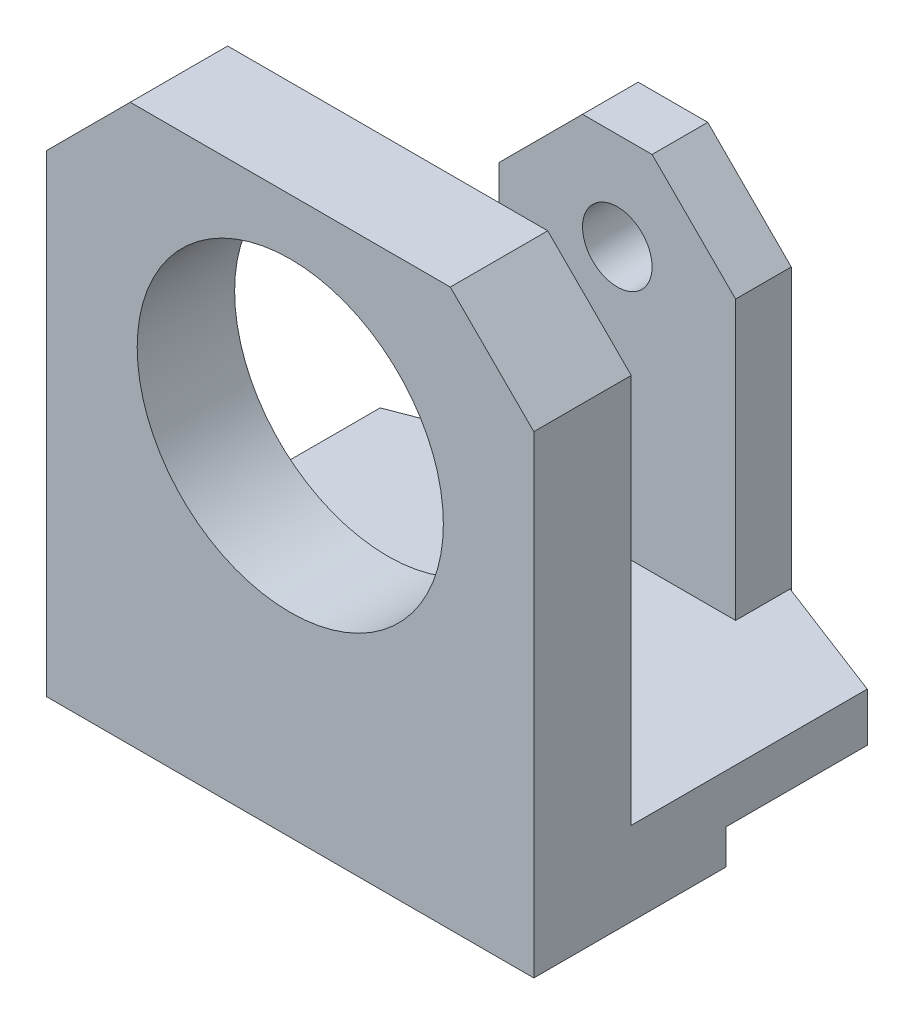
ISO-10303-21;
HEADER;
FILE_DESCRIPTION(('STEP AP214'),'2;1');
FILE_NAME('part.step','',(''),(''),'','','');
FILE_SCHEMA(('AUTOMOTIVE_DESIGN { 1 0 10303 214 1 1 1 1 }'));
ENDSEC;
DATA;
#1=APPLICATION_CONTEXT('core data for automotive mechanical design processes');
#2=APPLICATION_PROTOCOL_DEFINITION('international standard','automotive_design',2000,#1);
#3=PRODUCT_CONTEXT('',#1,'mechanical');
#4=PRODUCT('Part','Part','',(#3));
#5=PRODUCT_RELATED_PRODUCT_CATEGORY('part','',(#4));
#6=PRODUCT_DEFINITION_FORMATION('','',#4);
#7=PRODUCT_DEFINITION_CONTEXT('part definition',#1,'design');
#8=PRODUCT_DEFINITION('design','',#6,#7);
#9=PRODUCT_DEFINITION_SHAPE('','',#8);
#10=(LENGTH_UNIT() NAMED_UNIT(*) SI_UNIT(.MILLI.,.METRE.));
#11=(NAMED_UNIT(*) PLANE_ANGLE_UNIT() SI_UNIT($,.RADIAN.));
#12=(NAMED_UNIT(*) SI_UNIT($,.STERADIAN.) SOLID_ANGLE_UNIT());
#13=UNCERTAINTY_MEASURE_WITH_UNIT(LENGTH_MEASURE(1.E-05),#10,'distance_accuracy_value','');
#14=(GEOMETRIC_REPRESENTATION_CONTEXT(3) GLOBAL_UNCERTAINTY_ASSIGNED_CONTEXT((#13)) GLOBAL_UNIT_ASSIGNED_CONTEXT((#10,
#11,#12)) REPRESENTATION_CONTEXT('',''));
#15=CARTESIAN_POINT('',(0.,0.,0.));
#16=DIRECTION('',(0.,0.,1.));
#17=DIRECTION('',(1.,0.,0.));
#18=AXIS2_PLACEMENT_3D('',#15,#16,#17);
#19=CARTESIAN_POINT('',(0.,0.,0.));
#20=DIRECTION('',(0.,0.,1.));
#21=DIRECTION('',(1.,0.,0.));
#22=AXIS2_PLACEMENT_3D('',#19,#20,#21);
#23=PLANE('',#22);
#24=CARTESIAN_POINT('',(0.,0.,0.));
#25=DIRECTION('',(0.,0.,1.));
#26=DIRECTION('',(1.,0.,0.));
#27=AXIS2_PLACEMENT_3D('',#24,#25,#26);
#28=CIRCLE('',#27,11.);
#29=CARTESIAN_POINT('',(11.,0.,0.));
#30=VERTEX_POINT('',#29);
#31=EDGE_CURVE('E279',#30,#30,#28,.T.);
#32=ORIENTED_EDGE('',*,*,#31,.T.);
#33=EDGE_LOOP('',(#32));
#34=FACE_BOUND('',#33,.T.);
#35=DIRECTION('',(0.,-1.,0.));
#36=VECTOR('',#35,1.);
#37=CARTESIAN_POINT('',(-17.5,15.,0.));
#38=LINE('',#37,#36);
#39=CARTESIAN_POINT('',(-17.5,8.99999999999999,0.));
#40=VERTEX_POINT('',#39);
#41=CARTESIAN_POINT('',(-17.5,-19.,0.));
#42=VERTEX_POINT('',#41);
#43=EDGE_CURVE('E275',#40,#42,#38,.T.);
#44=ORIENTED_EDGE('',*,*,#43,.F.);
#45=DIRECTION('',(-0.707106781186548,-0.707106781186548,0.));
#46=VECTOR('',#45,1.);
#47=CARTESIAN_POINT('',(-17.5,8.99999999999999,0.));
#48=LINE('',#47,#46);
#49=CARTESIAN_POINT('',(-11.5,15.,0.));
#50=VERTEX_POINT('',#49);
#51=EDGE_CURVE('E227',#40,#50,#48,.F.);
#52=ORIENTED_EDGE('',*,*,#51,.T.);
#53=DIRECTION('',(-1.,0.,0.));
#54=VECTOR('',#53,1.);
#55=CARTESIAN_POINT('',(17.5,15.,0.));
#56=LINE('',#55,#54);
#57=CARTESIAN_POINT('',(11.5,15.,0.));
#58=VERTEX_POINT('',#57);
#59=EDGE_CURVE('E270',#58,#50,#56,.T.);
#60=ORIENTED_EDGE('',*,*,#59,.F.);
#61=DIRECTION('',(-0.707106781186548,0.707106781186548,0.));
#62=VECTOR('',#61,1.);
#63=CARTESIAN_POINT('',(11.5,15.,0.));
#64=LINE('',#63,#62);
#65=CARTESIAN_POINT('',(17.5,8.99999999999999,0.));
#66=VERTEX_POINT('',#65);
#67=EDGE_CURVE('E225',#58,#66,#64,.F.);
#68=ORIENTED_EDGE('',*,*,#67,.T.);
#69=DIRECTION('',(0.,1.,0.));
#70=VECTOR('',#69,1.);
#71=CARTESIAN_POINT('',(17.5,-25.,0.));
#72=LINE('',#71,#70);
#73=CARTESIAN_POINT('',(17.5,-19.,0.));
#74=VERTEX_POINT('',#73);
#75=EDGE_CURVE('E200',#74,#66,#72,.T.);
#76=ORIENTED_EDGE('',*,*,#75,.F.);
#77=DIRECTION('',(1.,0.,0.));
#78=VECTOR('',#77,1.);
#79=CARTESIAN_POINT('',(17.5,-19.,0.));
#80=LINE('',#79,#78);
#81=EDGE_CURVE('E294',#42,#74,#80,.T.);
#82=ORIENTED_EDGE('',*,*,#81,.F.);
#83=EDGE_LOOP('',(#44,#52,#60,#68,#76,#82));
#84=FACE_BOUND('',#83,.T.);
#85=ADVANCED_FACE('F41',(#34,#84),#23,.F.);
#86=CARTESIAN_POINT('',(0.,0.,7.));
#87=DIRECTION('',(0.,0.,1.));
#88=DIRECTION('',(1.,0.,0.));
#89=AXIS2_PLACEMENT_3D('',#86,#87,#88);
#90=PLANE('',#89);
#91=DIRECTION('',(-1.,0.,0.));
#92=VECTOR('',#91,1.);
#93=CARTESIAN_POINT('',(17.5,15.,7.));
#94=LINE('',#93,#92);
#95=CARTESIAN_POINT('',(11.5,15.,7.));
#96=VERTEX_POINT('',#95);
#97=CARTESIAN_POINT('',(-11.5,15.,7.));
#98=VERTEX_POINT('',#97);
#99=EDGE_CURVE('E272',#96,#98,#94,.T.);
#100=ORIENTED_EDGE('',*,*,#99,.T.);
#101=DIRECTION('',(0.707106781186548,0.707106781186548,0.));
#102=VECTOR('',#101,1.);
#103=CARTESIAN_POINT('',(-13.25,13.25,7.));
#104=LINE('',#103,#102);
#105=CARTESIAN_POINT('',(-17.5,8.99999999999999,7.));
#106=VERTEX_POINT('',#105);
#107=EDGE_CURVE('E236',#98,#106,#104,.F.);
#108=ORIENTED_EDGE('',*,*,#107,.T.);
#109=DIRECTION('',(0.,-1.,0.));
#110=VECTOR('',#109,1.);
#111=CARTESIAN_POINT('',(-17.5,15.,7.));
#112=LINE('',#111,#110);
#113=CARTESIAN_POINT('',(-17.5,-25.,7.));
#114=VERTEX_POINT('',#113);
#115=EDGE_CURVE('E283',#106,#114,#112,.T.);
#116=ORIENTED_EDGE('',*,*,#115,.T.);
#117=DIRECTION('',(1.,0.,0.));
#118=VECTOR('',#117,1.);
#119=CARTESIAN_POINT('',(-17.5,-25.,7.));
#120=LINE('',#119,#118);
#121=CARTESIAN_POINT('',(17.5,-25.,7.));
#122=VERTEX_POINT('',#121);
#123=EDGE_CURVE('E197',#114,#122,#120,.T.);
#124=ORIENTED_EDGE('',*,*,#123,.T.);
#125=DIRECTION('',(0.,1.,0.));
#126=VECTOR('',#125,1.);
#127=CARTESIAN_POINT('',(17.5,-25.,7.));
#128=LINE('',#127,#126);
#129=CARTESIAN_POINT('',(17.5,8.99999999999999,7.));
#130=VERTEX_POINT('',#129);
#131=EDGE_CURVE('E193',#122,#130,#128,.T.);
#132=ORIENTED_EDGE('',*,*,#131,.T.);
#133=DIRECTION('',(0.707106781186548,-0.707106781186548,0.));
#134=VECTOR('',#133,1.);
#135=CARTESIAN_POINT('',(13.25,13.25,7.));
#136=LINE('',#135,#134);
#137=EDGE_CURVE('E234',#130,#96,#136,.F.);
#138=ORIENTED_EDGE('',*,*,#137,.T.);
#139=EDGE_LOOP('',(#100,#108,#116,#124,#132,#138));
#140=FACE_BOUND('',#139,.T.);
#141=CARTESIAN_POINT('',(0.,0.,7.));
#142=DIRECTION('',(0.,0.,1.));
#143=DIRECTION('',(1.,0.,0.));
#144=AXIS2_PLACEMENT_3D('',#141,#142,#143);
#145=CIRCLE('',#144,11.);
#146=CARTESIAN_POINT('',(11.,0.,7.));
#147=VERTEX_POINT('',#146);
#148=EDGE_CURVE('E276',#147,#147,#145,.T.);
#149=ORIENTED_EDGE('',*,*,#148,.F.);
#150=EDGE_LOOP('',(#149));
#151=FACE_BOUND('',#150,.T.);
#152=ADVANCED_FACE('F262',(#140,#151),#90,.T.);
#153=CARTESIAN_POINT('',(17.5,15.,7.));
#154=DIRECTION('',(0.,-1.,0.));
#155=DIRECTION('',(0.,0.,-1.));
#156=AXIS2_PLACEMENT_3D('',#153,#154,#155);
#157=PLANE('',#156);
#158=ORIENTED_EDGE('',*,*,#59,.T.);
#159=DIRECTION('',(0.,0.,1.));
#160=VECTOR('',#159,1.);
#161=CARTESIAN_POINT('',(-11.5,15.,7.));
#162=LINE('',#161,#160);
#163=EDGE_CURVE('E232',#50,#98,#162,.T.);
#164=ORIENTED_EDGE('',*,*,#163,.T.);
#165=ORIENTED_EDGE('',*,*,#99,.F.);
#166=DIRECTION('',(0.,0.,-1.));
#167=VECTOR('',#166,1.);
#168=CARTESIAN_POINT('',(11.5,15.,7.));
#169=LINE('',#168,#167);
#170=EDGE_CURVE('E229',#96,#58,#169,.T.);
#171=ORIENTED_EDGE('',*,*,#170,.T.);
#172=EDGE_LOOP('',(#158,#164,#165,#171));
#173=FACE_BOUND('',#172,.T.);
#174=ADVANCED_FACE('F269',(#173),#157,.F.);
#175=CARTESIAN_POINT('',(-17.5,15.,7.));
#176=DIRECTION('',(1.,0.,0.));
#177=DIRECTION('',(0.,0.,-1.));
#178=AXIS2_PLACEMENT_3D('',#175,#176,#177);
#179=PLANE('',#178);
#180=DIRECTION('',(0.,1.,0.));
#181=VECTOR('',#180,1.);
#182=CARTESIAN_POINT('',(-17.5,15.,-16.9606368420425));
#183=LINE('',#182,#181);
#184=CARTESIAN_POINT('',(-17.5,-19.,-16.9606368420425));
#185=VERTEX_POINT('',#184);
#186=CARTESIAN_POINT('',(-17.5,-22.5,-16.9606368420425));
#187=VERTEX_POINT('',#186);
#188=EDGE_CURVE('E215',#185,#187,#183,.F.);
#189=ORIENTED_EDGE('',*,*,#188,.T.);
#190=DIRECTION('',(0.,0.,-1.));
#191=VECTOR('',#190,1.);
#192=CARTESIAN_POINT('',(-17.5,-22.5,-6.80000000000002));
#193=LINE('',#192,#191);
#194=CARTESIAN_POINT('',(-17.5,-22.5,-6.80000000000002));
#195=VERTEX_POINT('',#194);
#196=EDGE_CURVE('E327',#195,#187,#193,.T.);
#197=ORIENTED_EDGE('',*,*,#196,.F.);
#198=DIRECTION('',(0.,1.,0.));
#199=VECTOR('',#198,1.);
#200=CARTESIAN_POINT('',(-17.5,-25.,-6.80000000000002));
#201=LINE('',#200,#199);
#202=CARTESIAN_POINT('',(-17.5,-25.,-6.80000000000002));
#203=VERTEX_POINT('',#202);
#204=EDGE_CURVE('E189',#203,#195,#201,.T.);
#205=ORIENTED_EDGE('',*,*,#204,.F.);
#206=DIRECTION('',(0.,0.,-1.));
#207=VECTOR('',#206,1.);
#208=CARTESIAN_POINT('',(-17.5,-25.,7.));
#209=LINE('',#208,#207);
#210=EDGE_CURVE('E188',#114,#203,#209,.T.);
#211=ORIENTED_EDGE('',*,*,#210,.F.);
#212=ORIENTED_EDGE('',*,*,#115,.F.);
#213=DIRECTION('',(0.,0.,-1.));
#214=VECTOR('',#213,1.);
#215=CARTESIAN_POINT('',(-17.5,8.99999999999999,7.));
#216=LINE('',#215,#214);
#217=EDGE_CURVE('E222',#106,#40,#216,.T.);
#218=ORIENTED_EDGE('',*,*,#217,.T.);
#219=ORIENTED_EDGE('',*,*,#43,.T.);
#220=DIRECTION('',(0.,0.,1.));
#221=VECTOR('',#220,1.);
#222=CARTESIAN_POINT('',(-17.5,-19.,-16.5));
#223=LINE('',#222,#221);
#224=EDGE_CURVE('E287',#185,#42,#223,.T.);
#225=ORIENTED_EDGE('',*,*,#224,.F.);
#226=EDGE_LOOP('',(#189,#197,#205,#211,#212,#218,#219,#225));
#227=FACE_BOUND('',#226,.T.);
#228=ADVANCED_FACE('F335',(#227),#179,.F.);
#229=CARTESIAN_POINT('',(-17.5,-25.,7.));
#230=DIRECTION('',(0.,1.,0.));
#231=DIRECTION('',(-1.,0.,0.));
#232=AXIS2_PLACEMENT_3D('',#229,#230,#231);
#233=PLANE('',#232);
#234=ORIENTED_EDGE('',*,*,#210,.T.);
#235=DIRECTION('',(-1.,0.,0.));
#236=VECTOR('',#235,1.);
#237=CARTESIAN_POINT('',(17.5,-25.,-6.80000000000002));
#238=LINE('',#237,#236);
#239=CARTESIAN_POINT('',(17.5,-25.,-6.80000000000002));
#240=VERTEX_POINT('',#239);
#241=EDGE_CURVE('E171',#240,#203,#238,.T.);
#242=ORIENTED_EDGE('',*,*,#241,.F.);
#243=DIRECTION('',(0.,0.,-1.));
#244=VECTOR('',#243,1.);
#245=CARTESIAN_POINT('',(17.5,-25.,7.));
#246=LINE('',#245,#244);
#247=EDGE_CURVE('E185',#122,#240,#246,.T.);
#248=ORIENTED_EDGE('',*,*,#247,.F.);
#249=ORIENTED_EDGE('',*,*,#123,.F.);
#250=EDGE_LOOP('',(#234,#242,#248,#249));
#251=FACE_BOUND('',#250,.T.);
#252=ADVANCED_FACE('F183',(#251),#233,.F.);
#253=CARTESIAN_POINT('',(17.5,-25.,7.));
#254=DIRECTION('',(-1.,0.,0.));
#255=DIRECTION('',(0.,0.,1.));
#256=AXIS2_PLACEMENT_3D('',#253,#254,#255);
#257=PLANE('',#256);
#258=DIRECTION('',(0.,-1.,0.));
#259=VECTOR('',#258,1.);
#260=CARTESIAN_POINT('',(17.5,-25.,-6.80000000000002));
#261=LINE('',#260,#259);
#262=CARTESIAN_POINT('',(17.5,-22.5,-6.80000000000002));
#263=VERTEX_POINT('',#262);
#264=EDGE_CURVE('E168',#263,#240,#261,.T.);
#265=ORIENTED_EDGE('',*,*,#264,.F.);
#266=DIRECTION('',(0.,0.,-1.));
#267=VECTOR('',#266,1.);
#268=CARTESIAN_POINT('',(17.5,-22.5,-6.80000000000002));
#269=LINE('',#268,#267);
#270=CARTESIAN_POINT('',(17.5,-22.5,-16.9606368420425));
#271=VERTEX_POINT('',#270);
#272=EDGE_CURVE('E326',#263,#271,#269,.T.);
#273=ORIENTED_EDGE('',*,*,#272,.T.);
#274=DIRECTION('',(0.,-1.,0.));
#275=VECTOR('',#274,1.);
#276=CARTESIAN_POINT('',(17.5,-25.,-16.9606368420425));
#277=LINE('',#276,#275);
#278=CARTESIAN_POINT('',(17.5,-19.,-16.9606368420425));
#279=VERTEX_POINT('',#278);
#280=EDGE_CURVE('E218',#271,#279,#277,.F.);
#281=ORIENTED_EDGE('',*,*,#280,.T.);
#282=DIRECTION('',(0.,0.,1.));
#283=VECTOR('',#282,1.);
#284=CARTESIAN_POINT('',(17.5,-19.,-16.5));
#285=LINE('',#284,#283);
#286=EDGE_CURVE('E291',#279,#74,#285,.T.);
#287=ORIENTED_EDGE('',*,*,#286,.T.);
#288=ORIENTED_EDGE('',*,*,#75,.T.);
#289=DIRECTION('',(0.,0.,1.));
#290=VECTOR('',#289,1.);
#291=CARTESIAN_POINT('',(17.5,8.99999999999999,7.));
#292=LINE('',#291,#290);
#293=EDGE_CURVE('E50',#66,#130,#292,.T.);
#294=ORIENTED_EDGE('',*,*,#293,.T.);
#295=ORIENTED_EDGE('',*,*,#131,.F.);
#296=ORIENTED_EDGE('',*,*,#247,.T.);
#297=EDGE_LOOP('',(#265,#273,#281,#287,#288,#294,#295,#296));
#298=FACE_BOUND('',#297,.T.);
#299=ADVANCED_FACE('F191',(#298),#257,.F.);
#300=CARTESIAN_POINT('',(0.,0.,7.));
#301=DIRECTION('',(0.,0.,-1.));
#302=DIRECTION('',(-1.,0.,0.));
#303=AXIS2_PLACEMENT_3D('',#300,#301,#302);
#304=CYLINDRICAL_SURFACE('',#303,11.);
#305=ORIENTED_EDGE('',*,*,#148,.T.);
#306=EDGE_LOOP('',(#305));
#307=FACE_BOUND('',#306,.T.);
#308=ORIENTED_EDGE('',*,*,#31,.F.);
#309=EDGE_LOOP('',(#308));
#310=FACE_BOUND('',#309,.T.);
#311=ADVANCED_FACE('F394',(#307,#310),#304,.F.);
#312=CARTESIAN_POINT('',(17.5,-19.,-16.5));
#313=DIRECTION('',(0.,-1.,0.));
#314=DIRECTION('',(0.,0.,-1.));
#315=AXIS2_PLACEMENT_3D('',#312,#313,#314);
#316=PLANE('',#315);
#317=ORIENTED_EDGE('',*,*,#81,.T.);
#318=ORIENTED_EDGE('',*,*,#286,.F.);
#319=DIRECTION('',(0.933580426497199,0.,0.358367949545307));
#320=VECTOR('',#319,1.);
#321=CARTESIAN_POINT('',(17.6541131047136,-19.,-16.9014783638153));
#322=LINE('',#321,#320);
#323=CARTESIAN_POINT('',(8.5,-19.,-20.4154131573613));
#324=VERTEX_POINT('',#323);
#325=EDGE_CURVE('E220',#279,#324,#322,.F.);
#326=ORIENTED_EDGE('',*,*,#325,.T.);
#327=DIRECTION('',(0.,0.,-1.));
#328=VECTOR('',#327,1.);
#329=CARTESIAN_POINT('',(8.5,-19.,-16.5));
#330=LINE('',#329,#328);
#331=CARTESIAN_POINT('',(8.5,-19.,-16.5));
#332=VERTEX_POINT('',#331);
#333=EDGE_CURVE('E206',#332,#324,#330,.T.);
#334=ORIENTED_EDGE('',*,*,#333,.F.);
#335=DIRECTION('',(1.,0.,0.));
#336=VECTOR('',#335,1.);
#337=CARTESIAN_POINT('',(17.5,-19.,-16.5));
#338=LINE('',#337,#336);
#339=CARTESIAN_POINT('',(-8.5,-19.,-16.5));
#340=VERTEX_POINT('',#339);
#341=EDGE_CURVE('E293',#340,#332,#338,.T.);
#342=ORIENTED_EDGE('',*,*,#341,.F.);
#343=DIRECTION('',(0.,0.,1.));
#344=VECTOR('',#343,1.);
#345=CARTESIAN_POINT('',(-8.5,-19.,-16.5));
#346=LINE('',#345,#344);
#347=CARTESIAN_POINT('',(-8.5,-19.,-20.4154131573613));
#348=VERTEX_POINT('',#347);
#349=EDGE_CURVE('E195',#348,#340,#346,.T.);
#350=ORIENTED_EDGE('',*,*,#349,.F.);
#351=DIRECTION('',(0.933580426497199,0.,-0.358367949545307));
#352=VECTOR('',#351,1.);
#353=CARTESIAN_POINT('',(12.8509213411407,-19.,-28.6112639750955));
#354=LINE('',#353,#352);
#355=EDGE_CURVE('E212',#348,#185,#354,.F.);
#356=ORIENTED_EDGE('',*,*,#355,.T.);
#357=ORIENTED_EDGE('',*,*,#224,.T.);
#358=EDGE_LOOP('',(#317,#318,#326,#334,#342,#350,#356,#357));
#359=FACE_BOUND('',#358,.T.);
#360=ADVANCED_FACE('F362',(#359),#316,.F.);
#361=CARTESIAN_POINT('',(0.,0.,-20.5));
#362=DIRECTION('',(0.,0.,1.));
#363=DIRECTION('',(1.,0.,0.));
#364=AXIS2_PLACEMENT_3D('',#361,#362,#363);
#365=PLANE('',#364);
#366=DIRECTION('',(0.,-1.,0.));
#367=VECTOR('',#366,1.);
#368=CARTESIAN_POINT('',(8.5,-25.,-20.5));
#369=LINE('',#368,#367);
#370=CARTESIAN_POINT('',(8.5,0.999999999999987,-20.5));
#371=VERTEX_POINT('',#370);
#372=CARTESIAN_POINT('',(8.5,-22.5,-20.5));
#373=VERTEX_POINT('',#372);
#374=EDGE_CURVE('E297',#371,#373,#369,.T.);
#375=ORIENTED_EDGE('',*,*,#374,.T.);
#376=DIRECTION('',(1.,0.,0.));
#377=VECTOR('',#376,1.);
#378=CARTESIAN_POINT('',(17.5,-22.5,-20.5));
#379=LINE('',#378,#377);
#380=CARTESIAN_POINT('',(-8.5,-22.5,-20.5));
#381=VERTEX_POINT('',#380);
#382=EDGE_CURVE('E178',#381,#373,#379,.T.);
#383=ORIENTED_EDGE('',*,*,#382,.F.);
#384=DIRECTION('',(0.,1.,0.));
#385=VECTOR('',#384,1.);
#386=CARTESIAN_POINT('',(-8.5,7.00000000000001,-20.5));
#387=LINE('',#386,#385);
#388=CARTESIAN_POINT('',(-8.5,0.999999999999987,-20.5));
#389=VERTEX_POINT('',#388);
#390=EDGE_CURVE('E302',#381,#389,#387,.T.);
#391=ORIENTED_EDGE('',*,*,#390,.T.);
#392=DIRECTION('',(-0.707106781186548,-0.707106781186548,0.));
#393=VECTOR('',#392,1.);
#394=CARTESIAN_POINT('',(-2.49999999999998,7.00000000000001,-20.5));
#395=LINE('',#394,#393);
#396=CARTESIAN_POINT('',(-2.49999999999998,7.00000000000001,-20.5));
#397=VERTEX_POINT('',#396);
#398=EDGE_CURVE('E251',#389,#397,#395,.F.);
#399=ORIENTED_EDGE('',*,*,#398,.T.);
#400=DIRECTION('',(1.,0.,0.));
#401=VECTOR('',#400,1.);
#402=CARTESIAN_POINT('',(8.5,7.00000000000001,-20.5));
#403=LINE('',#402,#401);
#404=CARTESIAN_POINT('',(2.49999999999998,7.00000000000001,-20.5));
#405=VERTEX_POINT('',#404);
#406=EDGE_CURVE('E311',#397,#405,#403,.T.);
#407=ORIENTED_EDGE('',*,*,#406,.T.);
#408=DIRECTION('',(-0.707106781186548,0.707106781186548,0.));
#409=VECTOR('',#408,1.);
#410=CARTESIAN_POINT('',(8.5,0.999999999999987,-20.5));
#411=LINE('',#410,#409);
#412=EDGE_CURVE('E64',#405,#371,#411,.F.);
#413=ORIENTED_EDGE('',*,*,#412,.T.);
#414=EDGE_LOOP('',(#375,#383,#391,#399,#407,#413));
#415=FACE_BOUND('',#414,.T.);
#416=CARTESIAN_POINT('',(0.,0.,-20.5));
#417=DIRECTION('',(0.,0.,-1.));
#418=DIRECTION('',(-1.,0.,0.));
#419=AXIS2_PLACEMENT_3D('',#416,#417,#418);
#420=CIRCLE('',#419,2.5);
#421=CARTESIAN_POINT('',(-2.5,0.,-20.5));
#422=VERTEX_POINT('',#421);
#423=EDGE_CURVE('E309',#422,#422,#420,.T.);
#424=ORIENTED_EDGE('',*,*,#423,.F.);
#425=EDGE_LOOP('',(#424));
#426=FACE_BOUND('',#425,.T.);
#427=ADVANCED_FACE('F348',(#415,#426),#365,.F.);
#428=CARTESIAN_POINT('',(0.,0.,-16.5));
#429=DIRECTION('',(0.,0.,1.));
#430=DIRECTION('',(1.,0.,0.));
#431=AXIS2_PLACEMENT_3D('',#428,#429,#430);
#432=PLANE('',#431);
#433=DIRECTION('',(1.,0.,0.));
#434=VECTOR('',#433,1.);
#435=CARTESIAN_POINT('',(8.5,7.00000000000001,-16.5));
#436=LINE('',#435,#434);
#437=CARTESIAN_POINT('',(-2.49999999999998,7.00000000000001,-16.5));
#438=VERTEX_POINT('',#437);
#439=CARTESIAN_POINT('',(2.49999999999998,7.00000000000001,-16.5));
#440=VERTEX_POINT('',#439);
#441=EDGE_CURVE('E303',#438,#440,#436,.T.);
#442=ORIENTED_EDGE('',*,*,#441,.F.);
#443=DIRECTION('',(0.707106781186548,0.707106781186548,0.));
#444=VECTOR('',#443,1.);
#445=CARTESIAN_POINT('',(-4.74999999999999,4.74999999999999,-16.5));
#446=LINE('',#445,#444);
#447=CARTESIAN_POINT('',(-8.5,0.999999999999987,-16.5));
#448=VERTEX_POINT('',#447);
#449=EDGE_CURVE('E245',#438,#448,#446,.F.);
#450=ORIENTED_EDGE('',*,*,#449,.T.);
#451=DIRECTION('',(0.,1.,0.));
#452=VECTOR('',#451,1.);
#453=CARTESIAN_POINT('',(-8.5,7.00000000000001,-16.5));
#454=LINE('',#453,#452);
#455=EDGE_CURVE('E306',#340,#448,#454,.T.);
#456=ORIENTED_EDGE('',*,*,#455,.F.);
#457=ORIENTED_EDGE('',*,*,#341,.T.);
#458=DIRECTION('',(0.,-1.,0.));
#459=VECTOR('',#458,1.);
#460=CARTESIAN_POINT('',(8.5,-25.,-16.5));
#461=LINE('',#460,#459);
#462=CARTESIAN_POINT('',(8.5,0.999999999999987,-16.5));
#463=VERTEX_POINT('',#462);
#464=EDGE_CURVE('E300',#463,#332,#461,.T.);
#465=ORIENTED_EDGE('',*,*,#464,.F.);
#466=DIRECTION('',(0.707106781186548,-0.707106781186548,0.));
#467=VECTOR('',#466,1.);
#468=CARTESIAN_POINT('',(4.74999999999999,4.74999999999999,-16.5));
#469=LINE('',#468,#467);
#470=EDGE_CURVE('E243',#463,#440,#469,.F.);
#471=ORIENTED_EDGE('',*,*,#470,.T.);
#472=EDGE_LOOP('',(#442,#450,#456,#457,#465,#471));
#473=FACE_BOUND('',#472,.T.);
#474=CARTESIAN_POINT('',(0.,0.,-16.5));
#475=DIRECTION('',(0.,0.,-1.));
#476=DIRECTION('',(-1.,0.,0.));
#477=AXIS2_PLACEMENT_3D('',#474,#475,#476);
#478=CIRCLE('',#477,2.5);
#479=CARTESIAN_POINT('',(-2.5,0.,-16.5));
#480=VERTEX_POINT('',#479);
#481=EDGE_CURVE('E314',#480,#480,#478,.T.);
#482=ORIENTED_EDGE('',*,*,#481,.T.);
#483=EDGE_LOOP('',(#482));
#484=FACE_BOUND('',#483,.T.);
#485=ADVANCED_FACE('F428',(#473,#484),#432,.T.);
#486=CARTESIAN_POINT('',(-8.5,7.00000000000001,-20.5));
#487=DIRECTION('',(1.,0.,0.));
#488=DIRECTION('',(0.,0.,-1.));
#489=AXIS2_PLACEMENT_3D('',#486,#487,#488);
#490=PLANE('',#489);
#491=ORIENTED_EDGE('',*,*,#390,.F.);
#492=DIRECTION('',(0.,0.,1.));
#493=VECTOR('',#492,1.);
#494=CARTESIAN_POINT('',(-8.5,-22.5,-20.5));
#495=LINE('',#494,#493);
#496=CARTESIAN_POINT('',(-8.5,-22.5,-20.4154131573613));
#497=VERTEX_POINT('',#496);
#498=EDGE_CURVE('E317',#381,#497,#495,.T.);
#499=ORIENTED_EDGE('',*,*,#498,.T.);
#500=DIRECTION('',(0.,1.,0.));
#501=VECTOR('',#500,1.);
#502=CARTESIAN_POINT('',(-8.5,-19.,-20.4154131573613));
#503=LINE('',#502,#501);
#504=EDGE_CURVE('E204',#497,#348,#503,.T.);
#505=ORIENTED_EDGE('',*,*,#504,.T.);
#506=ORIENTED_EDGE('',*,*,#349,.T.);
#507=ORIENTED_EDGE('',*,*,#455,.T.);
#508=DIRECTION('',(0.,0.,-1.));
#509=VECTOR('',#508,1.);
#510=CARTESIAN_POINT('',(-8.5,0.999999999999987,-20.5));
#511=LINE('',#510,#509);
#512=EDGE_CURVE('E247',#448,#389,#511,.T.);
#513=ORIENTED_EDGE('',*,*,#512,.T.);
#514=EDGE_LOOP('',(#491,#499,#505,#506,#507,#513));
#515=FACE_BOUND('',#514,.T.);
#516=ADVANCED_FACE('F345',(#515),#490,.F.);
#517=CARTESIAN_POINT('',(8.5,7.00000000000001,-20.5));
#518=DIRECTION('',(0.,-1.,0.));
#519=DIRECTION('',(0.,0.,-1.));
#520=AXIS2_PLACEMENT_3D('',#517,#518,#519);
#521=PLANE('',#520);
#522=ORIENTED_EDGE('',*,*,#406,.F.);
#523=DIRECTION('',(0.,0.,1.));
#524=VECTOR('',#523,1.);
#525=CARTESIAN_POINT('',(-2.49999999999998,7.00000000000001,-20.5));
#526=LINE('',#525,#524);
#527=EDGE_CURVE('E240',#397,#438,#526,.T.);
#528=ORIENTED_EDGE('',*,*,#527,.T.);
#529=ORIENTED_EDGE('',*,*,#441,.T.);
#530=DIRECTION('',(0.,0.,-1.));
#531=VECTOR('',#530,1.);
#532=CARTESIAN_POINT('',(2.49999999999998,7.00000000000001,-20.5));
#533=LINE('',#532,#531);
#534=EDGE_CURVE('E238',#440,#405,#533,.T.);
#535=ORIENTED_EDGE('',*,*,#534,.T.);
#536=EDGE_LOOP('',(#522,#528,#529,#535));
#537=FACE_BOUND('',#536,.T.);
#538=ADVANCED_FACE('F434',(#537),#521,.F.);
#539=CARTESIAN_POINT('',(8.5,-25.,-20.5));
#540=DIRECTION('',(-1.,0.,0.));
#541=DIRECTION('',(0.,0.,1.));
#542=AXIS2_PLACEMENT_3D('',#539,#540,#541);
#543=PLANE('',#542);
#544=DIRECTION('',(0.,-1.,0.));
#545=VECTOR('',#544,1.);
#546=CARTESIAN_POINT('',(8.5,-25.,-20.4154131573613));
#547=LINE('',#546,#545);
#548=CARTESIAN_POINT('',(8.5,-22.5,-20.4154131573613));
#549=VERTEX_POINT('',#548);
#550=EDGE_CURVE('E209',#324,#549,#547,.T.);
#551=ORIENTED_EDGE('',*,*,#550,.T.);
#552=DIRECTION('',(0.,0.,-1.));
#553=VECTOR('',#552,1.);
#554=CARTESIAN_POINT('',(8.5,-22.5,-20.5));
#555=LINE('',#554,#553);
#556=EDGE_CURVE('E57',#549,#373,#555,.T.);
#557=ORIENTED_EDGE('',*,*,#556,.T.);
#558=ORIENTED_EDGE('',*,*,#374,.F.);
#559=DIRECTION('',(0.,0.,1.));
#560=VECTOR('',#559,1.);
#561=CARTESIAN_POINT('',(8.5,0.999999999999987,-20.5));
#562=LINE('',#561,#560);
#563=EDGE_CURVE('E253',#371,#463,#562,.T.);
#564=ORIENTED_EDGE('',*,*,#563,.T.);
#565=ORIENTED_EDGE('',*,*,#464,.T.);
#566=ORIENTED_EDGE('',*,*,#333,.T.);
#567=EDGE_LOOP('',(#551,#557,#558,#564,#565,#566));
#568=FACE_BOUND('',#567,.T.);
#569=ADVANCED_FACE('F352',(#568),#543,.F.);
#570=CARTESIAN_POINT('',(0.,0.,-20.5));
#571=DIRECTION('',(0.,0.,1.));
#572=DIRECTION('',(1.,0.,0.));
#573=AXIS2_PLACEMENT_3D('',#570,#571,#572);
#574=CYLINDRICAL_SURFACE('',#573,2.5);
#575=ORIENTED_EDGE('',*,*,#423,.T.);
#576=EDGE_LOOP('',(#575));
#577=FACE_BOUND('',#576,.T.);
#578=ORIENTED_EDGE('',*,*,#481,.F.);
#579=EDGE_LOOP('',(#578));
#580=FACE_BOUND('',#579,.T.);
#581=ADVANCED_FACE('F406',(#577,#580),#574,.F.);
#582=CARTESIAN_POINT('',(-8.5,7.00000000000001,-20.4154131573613));
#583=DIRECTION('',(-0.358367949545307,0.,-0.933580426497199));
#584=DIRECTION('',(0.,-1.,0.));
#585=AXIS2_PLACEMENT_3D('',#582,#583,#584);
#586=PLANE('',#585);
#587=ORIENTED_EDGE('',*,*,#504,.F.);
#588=DIRECTION('',(0.933580426497199,0.,-0.358367949545307));
#589=VECTOR('',#588,1.);
#590=CARTESIAN_POINT('',(-8.5,-22.5,-20.4154131573613));
#591=LINE('',#590,#589);
#592=EDGE_CURVE('E322',#497,#187,#591,.F.);
#593=ORIENTED_EDGE('',*,*,#592,.T.);
#594=ORIENTED_EDGE('',*,*,#188,.F.);
#595=ORIENTED_EDGE('',*,*,#355,.F.);
#596=EDGE_LOOP('',(#587,#593,#594,#595));
#597=FACE_BOUND('',#596,.T.);
#598=ADVANCED_FACE('F340',(#597),#586,.T.);
#599=CARTESIAN_POINT('',(8.5,-25.,-20.4154131573613));
#600=DIRECTION('',(0.358367949545307,0.,-0.933580426497199));
#601=DIRECTION('',(0.,1.,0.));
#602=AXIS2_PLACEMENT_3D('',#599,#600,#601);
#603=PLANE('',#602);
#604=ORIENTED_EDGE('',*,*,#280,.F.);
#605=DIRECTION('',(0.933580426497199,0.,0.358367949545307));
#606=VECTOR('',#605,1.);
#607=CARTESIAN_POINT('',(8.5,-22.5,-20.4154131573613));
#608=LINE('',#607,#606);
#609=EDGE_CURVE('E11',#271,#549,#608,.F.);
#610=ORIENTED_EDGE('',*,*,#609,.T.);
#611=ORIENTED_EDGE('',*,*,#550,.F.);
#612=ORIENTED_EDGE('',*,*,#325,.F.);
#613=EDGE_LOOP('',(#604,#610,#611,#612));
#614=FACE_BOUND('',#613,.T.);
#615=ADVANCED_FACE('F359',(#614),#603,.T.);
#616=CARTESIAN_POINT('',(-17.5,8.99999999999999,7.));
#617=DIRECTION('',(0.707106781186547,-0.707106781186547,0.));
#618=DIRECTION('',(0.,0.,-1.));
#619=AXIS2_PLACEMENT_3D('',#616,#617,#618);
#620=PLANE('',#619);
#621=ORIENTED_EDGE('',*,*,#107,.F.);
#622=ORIENTED_EDGE('',*,*,#163,.F.);
#623=ORIENTED_EDGE('',*,*,#51,.F.);
#624=ORIENTED_EDGE('',*,*,#217,.F.);
#625=EDGE_LOOP('',(#621,#622,#623,#624));
#626=FACE_BOUND('',#625,.T.);
#627=ADVANCED_FACE('F368',(#626),#620,.F.);
#628=CARTESIAN_POINT('',(-2.49999999999998,7.00000000000001,-20.5));
#629=DIRECTION('',(0.707106781186547,-0.707106781186547,0.));
#630=DIRECTION('',(0.,0.,1.));
#631=AXIS2_PLACEMENT_3D('',#628,#629,#630);
#632=PLANE('',#631);
#633=ORIENTED_EDGE('',*,*,#398,.F.);
#634=ORIENTED_EDGE('',*,*,#512,.F.);
#635=ORIENTED_EDGE('',*,*,#449,.F.);
#636=ORIENTED_EDGE('',*,*,#527,.F.);
#637=EDGE_LOOP('',(#633,#634,#635,#636));
#638=FACE_BOUND('',#637,.T.);
#639=ADVANCED_FACE('F370',(#638),#632,.F.);
#640=CARTESIAN_POINT('',(8.5,0.999999999999987,-20.5));
#641=DIRECTION('',(-0.707106781186547,-0.707106781186547,0.));
#642=DIRECTION('',(0.,0.,1.));
#643=AXIS2_PLACEMENT_3D('',#640,#641,#642);
#644=PLANE('',#643);
#645=ORIENTED_EDGE('',*,*,#412,.F.);
#646=ORIENTED_EDGE('',*,*,#534,.F.);
#647=ORIENTED_EDGE('',*,*,#470,.F.);
#648=ORIENTED_EDGE('',*,*,#563,.F.);
#649=EDGE_LOOP('',(#645,#646,#647,#648));
#650=FACE_BOUND('',#649,.T.);
#651=ADVANCED_FACE('F376',(#650),#644,.F.);
#652=CARTESIAN_POINT('',(11.5,15.,7.));
#653=DIRECTION('',(-0.707106781186547,-0.707106781186547,0.));
#654=DIRECTION('',(0.,0.,-1.));
#655=AXIS2_PLACEMENT_3D('',#652,#653,#654);
#656=PLANE('',#655);
#657=ORIENTED_EDGE('',*,*,#137,.F.);
#658=ORIENTED_EDGE('',*,*,#293,.F.);
#659=ORIENTED_EDGE('',*,*,#67,.F.);
#660=ORIENTED_EDGE('',*,*,#170,.F.);
#661=EDGE_LOOP('',(#657,#658,#659,#660));
#662=FACE_BOUND('',#661,.T.);
#663=ADVANCED_FACE('F44',(#662),#656,.F.);
#664=CARTESIAN_POINT('',(17.5,-22.5,-6.80000000000002));
#665=DIRECTION('',(0.,1.,0.));
#666=DIRECTION('',(0.,0.,1.));
#667=AXIS2_PLACEMENT_3D('',#664,#665,#666);
#668=PLANE('',#667);
#669=ORIENTED_EDGE('',*,*,#382,.T.);
#670=ORIENTED_EDGE('',*,*,#556,.F.);
#671=ORIENTED_EDGE('',*,*,#609,.F.);
#672=ORIENTED_EDGE('',*,*,#272,.F.);
#673=DIRECTION('',(1.,0.,0.));
#674=VECTOR('',#673,1.);
#675=CARTESIAN_POINT('',(17.5,-22.5,-6.80000000000002));
#676=LINE('',#675,#674);
#677=EDGE_CURVE('E174',#195,#263,#676,.T.);
#678=ORIENTED_EDGE('',*,*,#677,.F.);
#679=ORIENTED_EDGE('',*,*,#196,.T.);
#680=ORIENTED_EDGE('',*,*,#592,.F.);
#681=ORIENTED_EDGE('',*,*,#498,.F.);
#682=EDGE_LOOP('',(#669,#670,#671,#672,#678,#679,#680,#681));
#683=FACE_BOUND('',#682,.T.);
#684=ADVANCED_FACE('F334',(#683),#668,.F.);
#685=CARTESIAN_POINT('',(0.,0.,-6.80000000000002));
#686=DIRECTION('',(0.,0.,1.));
#687=DIRECTION('',(1.,0.,0.));
#688=AXIS2_PLACEMENT_3D('',#685,#686,#687);
#689=PLANE('',#688);
#690=ORIENTED_EDGE('',*,*,#264,.T.);
#691=ORIENTED_EDGE('',*,*,#241,.T.);
#692=ORIENTED_EDGE('',*,*,#204,.T.);
#693=ORIENTED_EDGE('',*,*,#677,.T.);
#694=EDGE_LOOP('',(#690,#691,#692,#693));
#695=FACE_BOUND('',#694,.T.);
#696=ADVANCED_FACE('F170',(#695),#689,.F.);
#697=CLOSED_SHELL('',(#85,#152,#174,#228,#252,#299,#311,#360,#427,#485,#516,#538,#569,#581,#598,
#615,#627,#639,#651,#663,#684,#696));
#698=MANIFOLD_SOLID_BREP('B2',#697);
#699=ADVANCED_BREP_SHAPE_REPRESENTATION('',(#18,#698),#14);
#700=SHAPE_DEFINITION_REPRESENTATION(#9,#699);
ENDSEC;
END-ISO-10303-21;
